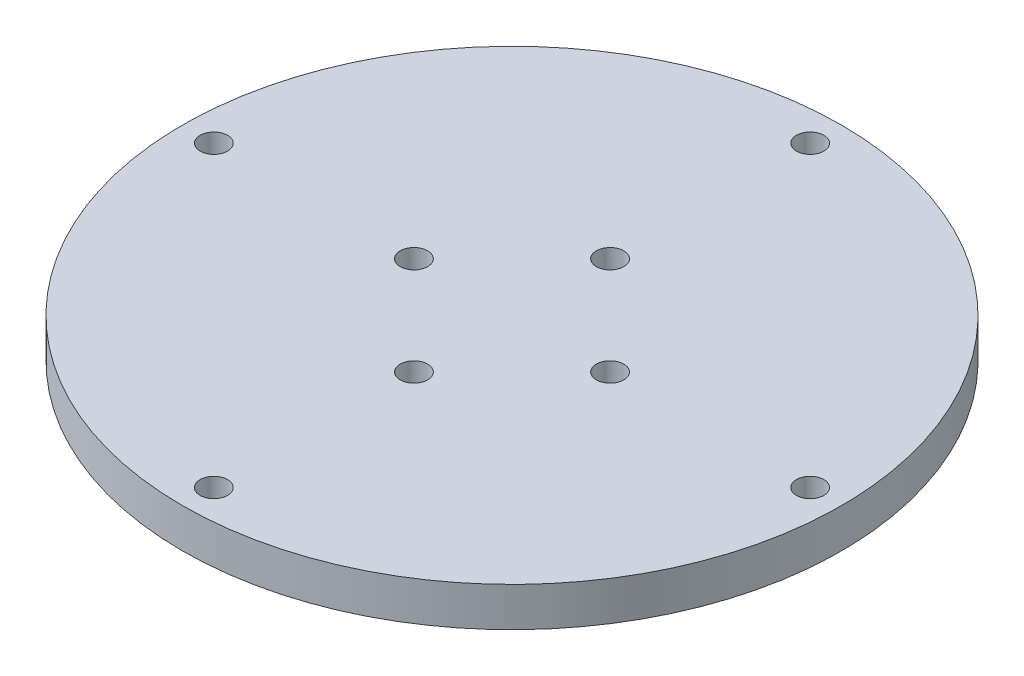
ISO-10303-21;
HEADER;
FILE_DESCRIPTION(('STEP AP214'),'2;1');
FILE_NAME('part.step','',(''),(''),'','','');
FILE_SCHEMA(('AUTOMOTIVE_DESIGN { 1 0 10303 214 1 1 1 1 }'));
ENDSEC;
DATA;
#1=APPLICATION_CONTEXT('core data for automotive mechanical design processes');
#2=APPLICATION_PROTOCOL_DEFINITION('international standard','automotive_design',2000,#1);
#3=PRODUCT_CONTEXT('',#1,'mechanical');
#4=PRODUCT('Part','Part','',(#3));
#5=PRODUCT_RELATED_PRODUCT_CATEGORY('part','',(#4));
#6=PRODUCT_DEFINITION_FORMATION('','',#4);
#7=PRODUCT_DEFINITION_CONTEXT('part definition',#1,'design');
#8=PRODUCT_DEFINITION('design','',#6,#7);
#9=PRODUCT_DEFINITION_SHAPE('','',#8);
#10=(LENGTH_UNIT() NAMED_UNIT(*) SI_UNIT(.MILLI.,.METRE.));
#11=(NAMED_UNIT(*) PLANE_ANGLE_UNIT() SI_UNIT($,.RADIAN.));
#12=(NAMED_UNIT(*) SI_UNIT($,.STERADIAN.) SOLID_ANGLE_UNIT());
#13=UNCERTAINTY_MEASURE_WITH_UNIT(LENGTH_MEASURE(1.E-05),#10,'distance_accuracy_value','');
#14=(GEOMETRIC_REPRESENTATION_CONTEXT(3) GLOBAL_UNCERTAINTY_ASSIGNED_CONTEXT((#13)) GLOBAL_UNIT_ASSIGNED_CONTEXT((#10,
#11,#12)) REPRESENTATION_CONTEXT('',''));
#15=CARTESIAN_POINT('',(0.,0.,0.));
#16=DIRECTION('',(0.,0.,1.));
#17=DIRECTION('',(1.,0.,0.));
#18=AXIS2_PLACEMENT_3D('',#15,#16,#17);
#19=CARTESIAN_POINT('',(0.,10.,0.));
#20=DIRECTION('',(0.,-1.,0.));
#21=DIRECTION('',(0.,0.,-1.));
#22=AXIS2_PLACEMENT_3D('',#19,#20,#21);
#23=CYLINDRICAL_SURFACE('',#22,84.);
#24=CARTESIAN_POINT('',(0.,10.,0.));
#25=DIRECTION('',(0.,1.,0.));
#26=DIRECTION('',(0.,0.,1.));
#27=AXIS2_PLACEMENT_3D('',#24,#25,#26);
#28=CIRCLE('',#27,84.);
#29=CARTESIAN_POINT('',(0.,10.,84.));
#30=VERTEX_POINT('',#29);
#31=EDGE_CURVE('E11',#30,#30,#28,.T.);
#32=ORIENTED_EDGE('',*,*,#31,.F.);
#33=EDGE_LOOP('',(#32));
#34=FACE_BOUND('',#33,.T.);
#35=CARTESIAN_POINT('',(0.,0.,0.));
#36=DIRECTION('',(0.,1.,0.));
#37=DIRECTION('',(0.,0.,1.));
#38=AXIS2_PLACEMENT_3D('',#35,#36,#37);
#39=CIRCLE('',#38,84.);
#40=CARTESIAN_POINT('',(0.,0.,84.));
#41=VERTEX_POINT('',#40);
#42=EDGE_CURVE('E47',#41,#41,#39,.T.);
#43=ORIENTED_EDGE('',*,*,#42,.T.);
#44=EDGE_LOOP('',(#43));
#45=FACE_BOUND('',#44,.T.);
#46=ADVANCED_FACE('F44',(#34,#45),#23,.T.);
#47=CARTESIAN_POINT('',(0.,10.,0.));
#48=DIRECTION('',(0.,1.,0.));
#49=DIRECTION('',(0.,0.,1.));
#50=AXIS2_PLACEMENT_3D('',#47,#48,#49);
#51=PLANE('',#50);
#52=CARTESIAN_POINT('',(0.,10.,-76.));
#53=DIRECTION('',(0.,1.,0.));
#54=DIRECTION('',(0.,0.,1.));
#55=AXIS2_PLACEMENT_3D('',#52,#53,#54);
#56=CIRCLE('',#55,3.5);
#57=CARTESIAN_POINT('',(0.,10.,-72.5));
#58=VERTEX_POINT('',#57);
#59=EDGE_CURVE('E127',#58,#58,#56,.T.);
#60=ORIENTED_EDGE('',*,*,#59,.F.);
#61=EDGE_LOOP('',(#60));
#62=FACE_BOUND('',#61,.T.);
#63=CARTESIAN_POINT('',(-76.,10.,0.));
#64=DIRECTION('',(0.,1.,0.));
#65=DIRECTION('',(0.,0.,1.));
#66=AXIS2_PLACEMENT_3D('',#63,#64,#65);
#67=CIRCLE('',#66,3.5);
#68=CARTESIAN_POINT('',(-76.,10.,3.5));
#69=VERTEX_POINT('',#68);
#70=EDGE_CURVE('E119',#69,#69,#67,.T.);
#71=ORIENTED_EDGE('',*,*,#70,.F.);
#72=EDGE_LOOP('',(#71));
#73=FACE_BOUND('',#72,.T.);
#74=CARTESIAN_POINT('',(76.,10.,0.));
#75=DIRECTION('',(0.,1.,0.));
#76=DIRECTION('',(0.,0.,1.));
#77=AXIS2_PLACEMENT_3D('',#74,#75,#76);
#78=CIRCLE('',#77,3.5);
#79=CARTESIAN_POINT('',(76.,10.,3.5));
#80=VERTEX_POINT('',#79);
#81=EDGE_CURVE('E110',#80,#80,#78,.T.);
#82=ORIENTED_EDGE('',*,*,#81,.F.);
#83=EDGE_LOOP('',(#82));
#84=FACE_BOUND('',#83,.T.);
#85=CARTESIAN_POINT('',(25.,10.,0.));
#86=DIRECTION('',(0.,1.,0.));
#87=DIRECTION('',(0.,0.,1.));
#88=AXIS2_PLACEMENT_3D('',#85,#86,#87);
#89=CIRCLE('',#88,3.5);
#90=CARTESIAN_POINT('',(25.,10.,3.5));
#91=VERTEX_POINT('',#90);
#92=EDGE_CURVE('E103',#91,#91,#89,.T.);
#93=ORIENTED_EDGE('',*,*,#92,.F.);
#94=EDGE_LOOP('',(#93));
#95=FACE_BOUND('',#94,.T.);
#96=CARTESIAN_POINT('',(0.,10.,-25.));
#97=DIRECTION('',(0.,1.,0.));
#98=DIRECTION('',(0.,0.,1.));
#99=AXIS2_PLACEMENT_3D('',#96,#97,#98);
#100=CIRCLE('',#99,3.5);
#101=CARTESIAN_POINT('',(0.,10.,-21.5));
#102=VERTEX_POINT('',#101);
#103=EDGE_CURVE('E92',#102,#102,#100,.T.);
#104=ORIENTED_EDGE('',*,*,#103,.F.);
#105=EDGE_LOOP('',(#104));
#106=FACE_BOUND('',#105,.T.);
#107=CARTESIAN_POINT('',(-25.,10.,0.));
#108=DIRECTION('',(0.,1.,0.));
#109=DIRECTION('',(0.,0.,1.));
#110=AXIS2_PLACEMENT_3D('',#107,#108,#109);
#111=CIRCLE('',#110,3.5);
#112=CARTESIAN_POINT('',(-25.,10.,3.5));
#113=VERTEX_POINT('',#112);
#114=EDGE_CURVE('E83',#113,#113,#111,.T.);
#115=ORIENTED_EDGE('',*,*,#114,.F.);
#116=EDGE_LOOP('',(#115));
#117=FACE_BOUND('',#116,.T.);
#118=CARTESIAN_POINT('',(0.,10.,25.));
#119=DIRECTION('',(0.,1.,0.));
#120=DIRECTION('',(0.,0.,1.));
#121=AXIS2_PLACEMENT_3D('',#118,#119,#120);
#122=CIRCLE('',#121,3.5);
#123=CARTESIAN_POINT('',(0.,10.,28.5));
#124=VERTEX_POINT('',#123);
#125=EDGE_CURVE('E75',#124,#124,#122,.T.);
#126=ORIENTED_EDGE('',*,*,#125,.F.);
#127=EDGE_LOOP('',(#126));
#128=FACE_BOUND('',#127,.T.);
#129=CARTESIAN_POINT('',(0.,10.,76.));
#130=DIRECTION('',(0.,1.,0.));
#131=DIRECTION('',(0.,0.,1.));
#132=AXIS2_PLACEMENT_3D('',#129,#130,#131);
#133=CIRCLE('',#132,3.5);
#134=CARTESIAN_POINT('',(0.,10.,79.5));
#135=VERTEX_POINT('',#134);
#136=EDGE_CURVE('E64',#135,#135,#133,.T.);
#137=ORIENTED_EDGE('',*,*,#136,.F.);
#138=EDGE_LOOP('',(#137));
#139=FACE_BOUND('',#138,.T.);
#140=ORIENTED_EDGE('',*,*,#31,.T.);
#141=EDGE_LOOP('',(#140));
#142=FACE_BOUND('',#141,.T.);
#143=ADVANCED_FACE('F152',(#62,#73,#84,#95,#106,#117,#128,#139,#142),#51,.T.);
#144=CARTESIAN_POINT('',(0.,0.,0.));
#145=DIRECTION('',(0.,1.,0.));
#146=DIRECTION('',(0.,0.,1.));
#147=AXIS2_PLACEMENT_3D('',#144,#145,#146);
#148=PLANE('',#147);
#149=CARTESIAN_POINT('',(0.,0.,-76.));
#150=DIRECTION('',(0.,1.,0.));
#151=DIRECTION('',(0.,0.,1.));
#152=AXIS2_PLACEMENT_3D('',#149,#150,#151);
#153=CIRCLE('',#152,3.5);
#154=CARTESIAN_POINT('',(0.,0.,-72.5));
#155=VERTEX_POINT('',#154);
#156=EDGE_CURVE('E124',#155,#155,#153,.T.);
#157=ORIENTED_EDGE('',*,*,#156,.T.);
#158=EDGE_LOOP('',(#157));
#159=FACE_BOUND('',#158,.T.);
#160=CARTESIAN_POINT('',(-76.,0.,0.));
#161=DIRECTION('',(0.,1.,0.));
#162=DIRECTION('',(0.,0.,1.));
#163=AXIS2_PLACEMENT_3D('',#160,#161,#162);
#164=CIRCLE('',#163,3.5);
#165=CARTESIAN_POINT('',(-76.,0.,3.5));
#166=VERTEX_POINT('',#165);
#167=EDGE_CURVE('E115',#166,#166,#164,.T.);
#168=ORIENTED_EDGE('',*,*,#167,.T.);
#169=EDGE_LOOP('',(#168));
#170=FACE_BOUND('',#169,.T.);
#171=CARTESIAN_POINT('',(76.,0.,0.));
#172=DIRECTION('',(0.,1.,0.));
#173=DIRECTION('',(0.,0.,1.));
#174=AXIS2_PLACEMENT_3D('',#171,#172,#173);
#175=CIRCLE('',#174,3.5);
#176=CARTESIAN_POINT('',(76.,0.,3.5));
#177=VERTEX_POINT('',#176);
#178=EDGE_CURVE('E107',#177,#177,#175,.T.);
#179=ORIENTED_EDGE('',*,*,#178,.T.);
#180=EDGE_LOOP('',(#179));
#181=FACE_BOUND('',#180,.T.);
#182=CARTESIAN_POINT('',(25.,0.,0.));
#183=DIRECTION('',(0.,1.,0.));
#184=DIRECTION('',(0.,0.,1.));
#185=AXIS2_PLACEMENT_3D('',#182,#183,#184);
#186=CIRCLE('',#185,3.5);
#187=CARTESIAN_POINT('',(25.,0.,3.5));
#188=VERTEX_POINT('',#187);
#189=EDGE_CURVE('E97',#188,#188,#186,.T.);
#190=ORIENTED_EDGE('',*,*,#189,.T.);
#191=EDGE_LOOP('',(#190));
#192=FACE_BOUND('',#191,.T.);
#193=CARTESIAN_POINT('',(0.,0.,-25.));
#194=DIRECTION('',(0.,1.,0.));
#195=DIRECTION('',(0.,0.,1.));
#196=AXIS2_PLACEMENT_3D('',#193,#194,#195);
#197=CIRCLE('',#196,3.5);
#198=CARTESIAN_POINT('',(0.,0.,-21.5));
#199=VERTEX_POINT('',#198);
#200=EDGE_CURVE('E88',#199,#199,#197,.T.);
#201=ORIENTED_EDGE('',*,*,#200,.T.);
#202=EDGE_LOOP('',(#201));
#203=FACE_BOUND('',#202,.T.);
#204=CARTESIAN_POINT('',(-25.,0.,0.));
#205=DIRECTION('',(0.,1.,0.));
#206=DIRECTION('',(0.,0.,1.));
#207=AXIS2_PLACEMENT_3D('',#204,#205,#206);
#208=CIRCLE('',#207,3.5);
#209=CARTESIAN_POINT('',(-25.,0.,3.5));
#210=VERTEX_POINT('',#209);
#211=EDGE_CURVE('E80',#210,#210,#208,.T.);
#212=ORIENTED_EDGE('',*,*,#211,.T.);
#213=EDGE_LOOP('',(#212));
#214=FACE_BOUND('',#213,.T.);
#215=CARTESIAN_POINT('',(0.,0.,25.));
#216=DIRECTION('',(0.,1.,0.));
#217=DIRECTION('',(0.,0.,1.));
#218=AXIS2_PLACEMENT_3D('',#215,#216,#217);
#219=CIRCLE('',#218,3.5);
#220=CARTESIAN_POINT('',(0.,0.,28.5));
#221=VERTEX_POINT('',#220);
#222=EDGE_CURVE('E69',#221,#221,#219,.T.);
#223=ORIENTED_EDGE('',*,*,#222,.T.);
#224=EDGE_LOOP('',(#223));
#225=FACE_BOUND('',#224,.T.);
#226=CARTESIAN_POINT('',(0.,0.,76.));
#227=DIRECTION('',(0.,1.,0.));
#228=DIRECTION('',(0.,0.,1.));
#229=AXIS2_PLACEMENT_3D('',#226,#227,#228);
#230=CIRCLE('',#229,3.5);
#231=CARTESIAN_POINT('',(0.,0.,79.5));
#232=VERTEX_POINT('',#231);
#233=EDGE_CURVE('E58',#232,#232,#230,.T.);
#234=ORIENTED_EDGE('',*,*,#233,.T.);
#235=EDGE_LOOP('',(#234));
#236=FACE_BOUND('',#235,.T.);
#237=ORIENTED_EDGE('',*,*,#42,.F.);
#238=EDGE_LOOP('',(#237));
#239=FACE_BOUND('',#238,.T.);
#240=ADVANCED_FACE('F138',(#159,#170,#181,#192,#203,#214,#225,#236,#239),#148,.F.);
#241=CARTESIAN_POINT('',(0.,10.,76.));
#242=DIRECTION('',(0.,1.,0.));
#243=DIRECTION('',(0.,0.,1.));
#244=AXIS2_PLACEMENT_3D('',#241,#242,#243);
#245=CYLINDRICAL_SURFACE('',#244,3.5);
#246=ORIENTED_EDGE('',*,*,#233,.F.);
#247=EDGE_LOOP('',(#246));
#248=FACE_BOUND('',#247,.T.);
#249=ORIENTED_EDGE('',*,*,#136,.T.);
#250=EDGE_LOOP('',(#249));
#251=FACE_BOUND('',#250,.T.);
#252=ADVANCED_FACE('F163',(#248,#251),#245,.F.);
#253=CARTESIAN_POINT('',(0.,10.,25.));
#254=DIRECTION('',(0.,1.,0.));
#255=DIRECTION('',(0.,0.,1.));
#256=AXIS2_PLACEMENT_3D('',#253,#254,#255);
#257=CYLINDRICAL_SURFACE('',#256,3.5);
#258=ORIENTED_EDGE('',*,*,#222,.F.);
#259=EDGE_LOOP('',(#258));
#260=FACE_BOUND('',#259,.T.);
#261=ORIENTED_EDGE('',*,*,#125,.T.);
#262=EDGE_LOOP('',(#261));
#263=FACE_BOUND('',#262,.T.);
#264=ADVANCED_FACE('F167',(#260,#263),#257,.F.);
#265=CARTESIAN_POINT('',(-25.,10.,0.));
#266=DIRECTION('',(0.,1.,0.));
#267=DIRECTION('',(0.,0.,1.));
#268=AXIS2_PLACEMENT_3D('',#265,#266,#267);
#269=CYLINDRICAL_SURFACE('',#268,3.5);
#270=ORIENTED_EDGE('',*,*,#211,.F.);
#271=EDGE_LOOP('',(#270));
#272=FACE_BOUND('',#271,.T.);
#273=ORIENTED_EDGE('',*,*,#114,.T.);
#274=EDGE_LOOP('',(#273));
#275=FACE_BOUND('',#274,.T.);
#276=ADVANCED_FACE('F173',(#272,#275),#269,.F.);
#277=CARTESIAN_POINT('',(0.,10.,-25.));
#278=DIRECTION('',(0.,1.,0.));
#279=DIRECTION('',(0.,0.,1.));
#280=AXIS2_PLACEMENT_3D('',#277,#278,#279);
#281=CYLINDRICAL_SURFACE('',#280,3.5);
#282=ORIENTED_EDGE('',*,*,#200,.F.);
#283=EDGE_LOOP('',(#282));
#284=FACE_BOUND('',#283,.T.);
#285=ORIENTED_EDGE('',*,*,#103,.T.);
#286=EDGE_LOOP('',(#285));
#287=FACE_BOUND('',#286,.T.);
#288=ADVANCED_FACE('F177',(#284,#287),#281,.F.);
#289=CARTESIAN_POINT('',(25.,10.,0.));
#290=DIRECTION('',(0.,1.,0.));
#291=DIRECTION('',(0.,0.,1.));
#292=AXIS2_PLACEMENT_3D('',#289,#290,#291);
#293=CYLINDRICAL_SURFACE('',#292,3.5);
#294=ORIENTED_EDGE('',*,*,#189,.F.);
#295=EDGE_LOOP('',(#294));
#296=FACE_BOUND('',#295,.T.);
#297=ORIENTED_EDGE('',*,*,#92,.T.);
#298=EDGE_LOOP('',(#297));
#299=FACE_BOUND('',#298,.T.);
#300=ADVANCED_FACE('F181',(#296,#299),#293,.F.);
#301=CARTESIAN_POINT('',(76.,10.,0.));
#302=DIRECTION('',(0.,1.,0.));
#303=DIRECTION('',(0.,0.,1.));
#304=AXIS2_PLACEMENT_3D('',#301,#302,#303);
#305=CYLINDRICAL_SURFACE('',#304,3.5);
#306=ORIENTED_EDGE('',*,*,#178,.F.);
#307=EDGE_LOOP('',(#306));
#308=FACE_BOUND('',#307,.T.);
#309=ORIENTED_EDGE('',*,*,#81,.T.);
#310=EDGE_LOOP('',(#309));
#311=FACE_BOUND('',#310,.T.);
#312=ADVANCED_FACE('F148',(#308,#311),#305,.F.);
#313=CARTESIAN_POINT('',(-76.,10.,0.));
#314=DIRECTION('',(0.,1.,0.));
#315=DIRECTION('',(0.,0.,1.));
#316=AXIS2_PLACEMENT_3D('',#313,#314,#315);
#317=CYLINDRICAL_SURFACE('',#316,3.5);
#318=ORIENTED_EDGE('',*,*,#167,.F.);
#319=EDGE_LOOP('',(#318));
#320=FACE_BOUND('',#319,.T.);
#321=ORIENTED_EDGE('',*,*,#70,.T.);
#322=EDGE_LOOP('',(#321));
#323=FACE_BOUND('',#322,.T.);
#324=ADVANCED_FACE('F143',(#320,#323),#317,.F.);
#325=CARTESIAN_POINT('',(0.,10.,-76.));
#326=DIRECTION('',(0.,1.,0.));
#327=DIRECTION('',(0.,0.,1.));
#328=AXIS2_PLACEMENT_3D('',#325,#326,#327);
#329=CYLINDRICAL_SURFACE('',#328,3.5);
#330=ORIENTED_EDGE('',*,*,#156,.F.);
#331=EDGE_LOOP('',(#330));
#332=FACE_BOUND('',#331,.T.);
#333=ORIENTED_EDGE('',*,*,#59,.T.);
#334=EDGE_LOOP('',(#333));
#335=FACE_BOUND('',#334,.T.);
#336=ADVANCED_FACE('F141',(#332,#335),#329,.F.);
#337=CLOSED_SHELL('',(#46,#143,#240,#252,#264,#276,#288,#300,#312,#324,#336));
#338=MANIFOLD_SOLID_BREP('B2',#337);
#339=ADVANCED_BREP_SHAPE_REPRESENTATION('',(#18,#338),#14);
#340=SHAPE_DEFINITION_REPRESENTATION(#9,#339);
ENDSEC;
END-ISO-10303-21;
